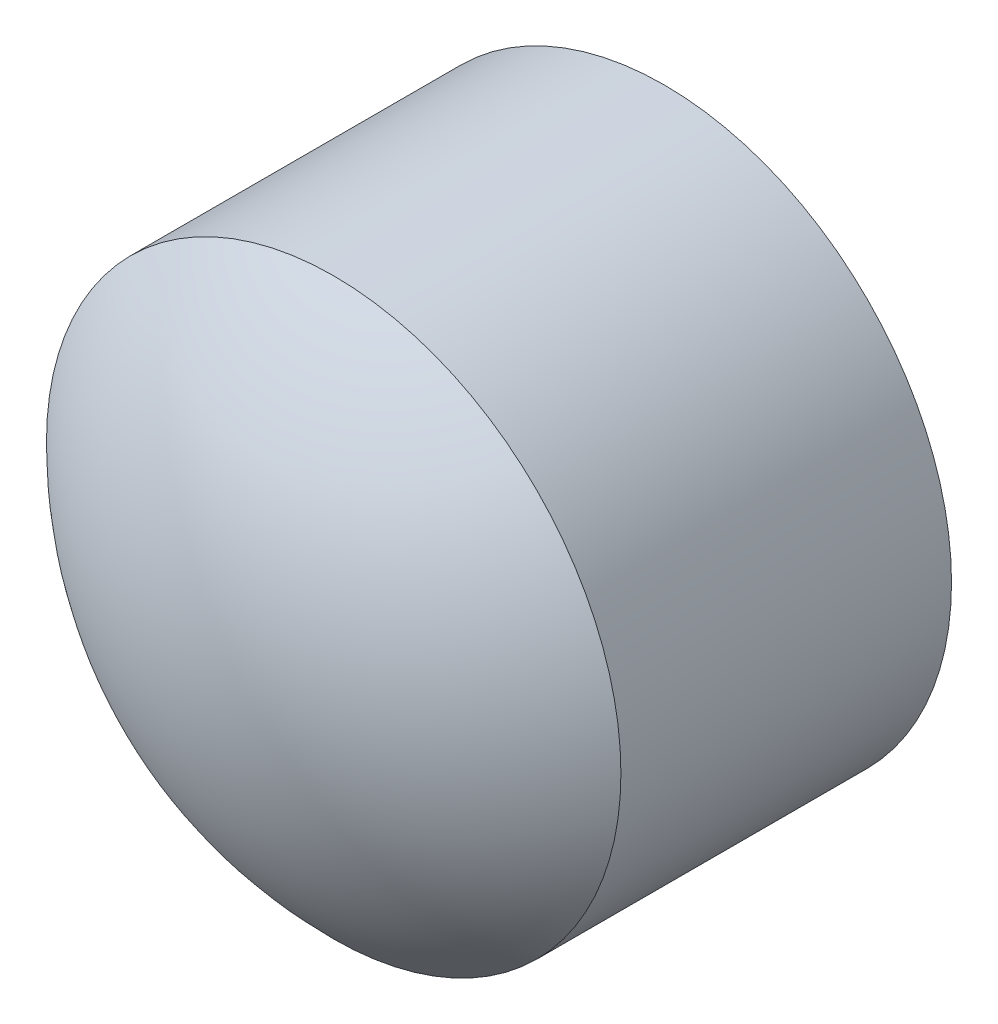
ISO-10303-21;
HEADER;
FILE_DESCRIPTION(('STEP AP214'),'2;1');
FILE_NAME('part.step','',(''),(''),'','','');
FILE_SCHEMA(('AUTOMOTIVE_DESIGN { 1 0 10303 214 1 1 1 1 }'));
ENDSEC;
DATA;
#1=APPLICATION_CONTEXT('core data for automotive mechanical design processes');
#2=APPLICATION_PROTOCOL_DEFINITION('international standard','automotive_design',2000,#1);
#3=PRODUCT_CONTEXT('',#1,'mechanical');
#4=PRODUCT('Part','Part','',(#3));
#5=PRODUCT_RELATED_PRODUCT_CATEGORY('part','',(#4));
#6=PRODUCT_DEFINITION_FORMATION('','',#4);
#7=PRODUCT_DEFINITION_CONTEXT('part definition',#1,'design');
#8=PRODUCT_DEFINITION('design','',#6,#7);
#9=PRODUCT_DEFINITION_SHAPE('','',#8);
#10=(LENGTH_UNIT() NAMED_UNIT(*) SI_UNIT(.MILLI.,.METRE.));
#11=(NAMED_UNIT(*) PLANE_ANGLE_UNIT() SI_UNIT($,.RADIAN.));
#12=(NAMED_UNIT(*) SI_UNIT($,.STERADIAN.) SOLID_ANGLE_UNIT());
#13=UNCERTAINTY_MEASURE_WITH_UNIT(LENGTH_MEASURE(1.E-05),#10,'distance_accuracy_value','');
#14=(GEOMETRIC_REPRESENTATION_CONTEXT(3) GLOBAL_UNCERTAINTY_ASSIGNED_CONTEXT((#13)) GLOBAL_UNIT_ASSIGNED_CONTEXT((#10,
#11,#12)) REPRESENTATION_CONTEXT('',''));
#15=CARTESIAN_POINT('',(0.,0.,0.));
#16=DIRECTION('',(0.,0.,1.));
#17=DIRECTION('',(1.,0.,0.));
#18=AXIS2_PLACEMENT_3D('',#15,#16,#17);
#19=CARTESIAN_POINT('',(0.,0.,16.4006088994022));
#20=DIRECTION('',(0.,0.,1.));
#21=DIRECTION('',(-1.,0.,0.));
#22=AXIS2_PLACEMENT_3D('',#19,#20,#21);
#23=SPHERICAL_SURFACE('',#22,14.5154614102124);
#24=CARTESIAN_POINT('',(0.,0.,2.14522542064513));
#25=DIRECTION('',(0.,0.,1.));
#26=DIRECTION('',(1.,0.,0.));
#27=AXIS2_PLACEMENT_3D('',#24,#25,#26);
#28=CIRCLE('',#27,2.73544545274543);
#29=CARTESIAN_POINT('',(2.73544545274543,0.,2.14522542064513));
#30=VERTEX_POINT('',#29);
#31=EDGE_CURVE('E104',#30,#30,#28,.T.);
#32=ORIENTED_EDGE('',*,*,#31,.F.);
#33=EDGE_LOOP('',(#32));
#34=FACE_BOUND('',#33,.T.);
#35=ADVANCED_FACE('F38',(#34),#23,.T.);
#36=CARTESIAN_POINT('',(0.,0.,10.8994949366117));
#37=DIRECTION('',(0.,0.,1.));
#38=DIRECTION('',(1.,0.,0.));
#39=AXIS2_PLACEMENT_3D('',#36,#37,#38);
#40=CYLINDRICAL_SURFACE('',#39,2.73544545274543);
#41=CARTESIAN_POINT('',(0.,0.,2.6057176451635));
#42=DIRECTION('',(0.,0.,1.));
#43=DIRECTION('',(1.,0.,0.));
#44=AXIS2_PLACEMENT_3D('',#41,#42,#43);
#45=CIRCLE('',#44,2.73544545274543);
#46=CARTESIAN_POINT('',(2.73544545274543,0.,2.6057176451635));
#47=VERTEX_POINT('',#46);
#48=EDGE_CURVE('E101',#47,#47,#45,.T.);
#49=ORIENTED_EDGE('',*,*,#48,.F.);
#50=EDGE_LOOP('',(#49));
#51=FACE_BOUND('',#50,.T.);
#52=ORIENTED_EDGE('',*,*,#31,.T.);
#53=EDGE_LOOP('',(#52));
#54=FACE_BOUND('',#53,.T.);
#55=ADVANCED_FACE('F108',(#51,#54),#40,.T.);
#56=CARTESIAN_POINT('',(-2.73544545274543,0.,2.6057176451635));
#57=DIRECTION('',(0.,0.,1.));
#58=DIRECTION('',(1.,0.,0.));
#59=AXIS2_PLACEMENT_3D('',#56,#57,#58);
#60=PLANE('',#59);
#61=CARTESIAN_POINT('',(0.,0.,2.6057176451635));
#62=DIRECTION('',(0.,0.,1.));
#63=DIRECTION('',(1.,0.,0.));
#64=AXIS2_PLACEMENT_3D('',#61,#62,#63);
#65=CIRCLE('',#64,5.5);
#66=CARTESIAN_POINT('',(5.5,0.,2.6057176451635));
#67=VERTEX_POINT('',#66);
#68=EDGE_CURVE('E46',#67,#67,#65,.F.);
#69=ORIENTED_EDGE('',*,*,#68,.T.);
#70=EDGE_LOOP('',(#69));
#71=FACE_BOUND('',#70,.T.);
#72=ORIENTED_EDGE('',*,*,#48,.T.);
#73=EDGE_LOOP('',(#72));
#74=FACE_BOUND('',#73,.T.);
#75=ADVANCED_FACE('F116',(#71,#74),#60,.F.);
#76=CARTESIAN_POINT('',(0.,0.,1.12027956855392));
#77=DIRECTION('',(0.,0.,-1.));
#78=DIRECTION('',(-1.,0.,0.));
#79=AXIS2_PLACEMENT_3D('',#76,#77,#78);
#80=SPHERICAL_SURFACE('',#79,9.77921536805774);
#81=CARTESIAN_POINT('',(0.,0.,8.));
#82=DIRECTION('',(0.,0.,1.));
#83=DIRECTION('',(1.,0.,0.));
#84=AXIS2_PLACEMENT_3D('',#81,#82,#83);
#85=CIRCLE('',#84,6.95);
#86=CARTESIAN_POINT('',(6.95,0.,8.));
#87=VERTEX_POINT('',#86);
#88=EDGE_CURVE('E54',#87,#87,#85,.T.);
#89=ORIENTED_EDGE('',*,*,#88,.T.);
#90=EDGE_LOOP('',(#89));
#91=FACE_BOUND('',#90,.T.);
#92=ADVANCED_FACE('F122',(#91),#80,.T.);
#93=CARTESIAN_POINT('',(0.,0.,8.));
#94=DIRECTION('',(0.,0.,-1.));
#95=DIRECTION('',(-1.,0.,0.));
#96=AXIS2_PLACEMENT_3D('',#93,#94,#95);
#97=CYLINDRICAL_SURFACE('',#96,6.95);
#98=ORIENTED_EDGE('',*,*,#88,.F.);
#99=EDGE_LOOP('',(#98));
#100=FACE_BOUND('',#99,.T.);
#101=CARTESIAN_POINT('',(0.,0.,0.));
#102=DIRECTION('',(0.,0.,1.));
#103=DIRECTION('',(1.,0.,0.));
#104=AXIS2_PLACEMENT_3D('',#101,#102,#103);
#105=CIRCLE('',#104,6.95);
#106=CARTESIAN_POINT('',(6.95,0.,0.));
#107=VERTEX_POINT('',#106);
#108=EDGE_CURVE('E57',#107,#107,#105,.T.);
#109=ORIENTED_EDGE('',*,*,#108,.T.);
#110=EDGE_LOOP('',(#109));
#111=FACE_BOUND('',#110,.T.);
#112=ADVANCED_FACE('F40',(#100,#111),#97,.T.);
#113=CARTESIAN_POINT('',(0.,0.,0.));
#114=DIRECTION('',(0.,0.,1.));
#115=DIRECTION('',(1.,0.,0.));
#116=AXIS2_PLACEMENT_3D('',#113,#114,#115);
#117=PLANE('',#116);
#118=CARTESIAN_POINT('',(0.,0.,0.));
#119=DIRECTION('',(0.,0.,1.));
#120=DIRECTION('',(1.,0.,0.));
#121=AXIS2_PLACEMENT_3D('',#118,#119,#120);
#122=CIRCLE('',#121,5.5);
#123=CARTESIAN_POINT('',(5.5,0.,0.));
#124=VERTEX_POINT('',#123);
#125=EDGE_CURVE('E65',#124,#124,#122,.T.);
#126=ORIENTED_EDGE('',*,*,#125,.T.);
#127=EDGE_LOOP('',(#126));
#128=FACE_BOUND('',#127,.T.);
#129=ORIENTED_EDGE('',*,*,#108,.F.);
#130=EDGE_LOOP('',(#129));
#131=FACE_BOUND('',#130,.T.);
#132=ADVANCED_FACE('F192',(#128,#131),#117,.F.);
#133=CARTESIAN_POINT('',(0.,0.,0.));
#134=DIRECTION('',(0.,0.,1.));
#135=DIRECTION('',(1.,0.,0.));
#136=AXIS2_PLACEMENT_3D('',#133,#134,#135);
#137=CYLINDRICAL_SURFACE('',#136,5.5);
#138=ORIENTED_EDGE('',*,*,#125,.F.);
#139=EDGE_LOOP('',(#138));
#140=FACE_BOUND('',#139,.T.);
#141=ORIENTED_EDGE('',*,*,#68,.F.);
#142=EDGE_LOOP('',(#141));
#143=FACE_BOUND('',#142,.T.);
#144=ADVANCED_FACE('F185',(#140,#143),#137,.F.);
#145=CLOSED_SHELL('',(#35,#55,#75,#92,#112,#132,#144));
#146=CARTESIAN_POINT('',(0.,0.,3.72106478336912));
#147=DIRECTION('',(0.,0.,1.));
#148=DIRECTION('',(1.,0.,0.));
#149=AXIS2_PLACEMENT_3D('',#146,#147,#148);
#150=CIRCLE('',#149,5.5);
#151=CARTESIAN_POINT('',(5.5,0.,3.72106478336912));
#152=VERTEX_POINT('',#151);
#153=EDGE_CURVE('E50',#152,#152,#150,.F.);
#154=ORIENTED_EDGE('',*,*,#153,.F.);
#155=EDGE_LOOP('',(#154));
#156=FACE_BOUND('',#155,.T.);
#157=CARTESIAN_POINT('',(0.,0.,3.25034469670122));
#158=DIRECTION('',(0.,0.,-1.));
#159=DIRECTION('',(-1.,0.,0.));
#160=AXIS2_PLACEMENT_3D('',#157,#158,#159);
#161=CIRCLE('',#160,5.5);
#162=CARTESIAN_POINT('',(-5.5,0.,3.25034469670122));
#163=VERTEX_POINT('',#162);
#164=EDGE_CURVE('E10',#163,#163,#161,.F.);
#165=ORIENTED_EDGE('',*,*,#164,.F.);
#166=EDGE_LOOP('',(#165));
#167=FACE_BOUND('',#166,.T.);
#168=ADVANCED_FACE('F145',(#156,#167),#137,.F.);
#169=CARTESIAN_POINT('',(0.,0.,2.68657492325472));
#170=DIRECTION('',(0.,0.,1.));
#171=DIRECTION('',(1.,0.,0.));
#172=AXIS2_PLACEMENT_3D('',#169,#170,#171);
#173=SPHERICAL_SURFACE('',#172,3.73646526489964);
#174=CARTESIAN_POINT('',(0.,0.,4.79490913685476));
#175=DIRECTION('',(0.,0.,1.));
#176=DIRECTION('',(1.,0.,0.));
#177=AXIS2_PLACEMENT_3D('',#174,#175,#176);
#178=CIRCLE('',#177,3.08481758286695);
#179=CARTESIAN_POINT('',(3.08481758286695,0.,4.79490913685477));
#180=VERTEX_POINT('',#179);
#181=EDGE_CURVE('E89',#180,#180,#178,.T.);
#182=ORIENTED_EDGE('',*,*,#181,.F.);
#183=EDGE_LOOP('',(#182));
#184=FACE_BOUND('',#183,.T.);
#185=ADVANCED_FACE('F141',(#184),#173,.F.);
#186=CARTESIAN_POINT('',(-3.71397770651986,0.,4.79490913685476));
#187=DIRECTION('',(0.,0.,1.));
#188=DIRECTION('',(1.,0.,0.));
#189=AXIS2_PLACEMENT_3D('',#186,#187,#188);
#190=PLANE('',#189);
#191=CARTESIAN_POINT('',(0.,0.,4.79490913685476));
#192=DIRECTION('',(0.,0.,1.));
#193=DIRECTION('',(1.,0.,0.));
#194=AXIS2_PLACEMENT_3D('',#191,#192,#193);
#195=CIRCLE('',#194,3.71397770651986);
#196=CARTESIAN_POINT('',(3.71397770651986,0.,4.79490913685477));
#197=VERTEX_POINT('',#196);
#198=EDGE_CURVE('E92',#197,#197,#195,.T.);
#199=ORIENTED_EDGE('',*,*,#198,.F.);
#200=EDGE_LOOP('',(#199));
#201=FACE_BOUND('',#200,.T.);
#202=ORIENTED_EDGE('',*,*,#181,.T.);
#203=EDGE_LOOP('',(#202));
#204=FACE_BOUND('',#203,.T.);
#205=ADVANCED_FACE('F137',(#201,#204),#190,.F.);
#206=CARTESIAN_POINT('',(0.,0.,10.8994949366117));
#207=DIRECTION('',(0.,0.,1.));
#208=DIRECTION('',(1.,0.,0.));
#209=AXIS2_PLACEMENT_3D('',#206,#207,#208);
#210=CYLINDRICAL_SURFACE('',#209,3.71397770651986);
#211=CARTESIAN_POINT('',(0.,0.,3.72106478336912));
#212=DIRECTION('',(0.,0.,1.));
#213=DIRECTION('',(1.,0.,0.));
#214=AXIS2_PLACEMENT_3D('',#211,#212,#213);
#215=CIRCLE('',#214,3.71397770651986);
#216=CARTESIAN_POINT('',(3.71397770651986,0.,3.72106478336912));
#217=VERTEX_POINT('',#216);
#218=EDGE_CURVE('E77',#217,#217,#215,.T.);
#219=ORIENTED_EDGE('',*,*,#218,.F.);
#220=EDGE_LOOP('',(#219));
#221=FACE_BOUND('',#220,.T.);
#222=ORIENTED_EDGE('',*,*,#198,.T.);
#223=EDGE_LOOP('',(#222));
#224=FACE_BOUND('',#223,.T.);
#225=ADVANCED_FACE('F140',(#221,#224),#210,.F.);
#226=CARTESIAN_POINT('',(-5.5,0.,3.72106478336912));
#227=DIRECTION('',(0.,0.,1.));
#228=DIRECTION('',(1.,0.,0.));
#229=AXIS2_PLACEMENT_3D('',#226,#227,#228);
#230=PLANE('',#229);
#231=ORIENTED_EDGE('',*,*,#153,.T.);
#232=EDGE_LOOP('',(#231));
#233=FACE_BOUND('',#232,.T.);
#234=ORIENTED_EDGE('',*,*,#218,.T.);
#235=EDGE_LOOP('',(#234));
#236=FACE_BOUND('',#235,.T.);
#237=ADVANCED_FACE('F135',(#233,#236),#230,.F.);
#238=CARTESIAN_POINT('',(0.,0.,10.8873616664678));
#239=DIRECTION('',(0.,0.,1.));
#240=DIRECTION('',(-1.,0.,0.));
#241=AXIS2_PLACEMENT_3D('',#238,#239,#240);
#242=SPHERICAL_SURFACE('',#241,7.16629688309866);
#243=CARTESIAN_POINT('',(0.,0.,4.26368072670597));
#244=DIRECTION('',(0.,0.,1.));
#245=DIRECTION('',(1.,0.,0.));
#246=AXIS2_PLACEMENT_3D('',#243,#244,#245);
#247=CIRCLE('',#246,2.73544545274543);
#248=CARTESIAN_POINT('',(2.73544545274543,0.,4.26368072670597));
#249=VERTEX_POINT('',#248);
#250=EDGE_CURVE('E95',#249,#249,#247,.T.);
#251=ORIENTED_EDGE('',*,*,#250,.T.);
#252=EDGE_LOOP('',(#251));
#253=FACE_BOUND('',#252,.T.);
#254=ADVANCED_FACE('F131',(#253),#242,.F.);
#255=CARTESIAN_POINT('',(0.,0.,10.8994949366117));
#256=DIRECTION('',(0.,0.,1.));
#257=DIRECTION('',(1.,0.,0.));
#258=AXIS2_PLACEMENT_3D('',#255,#256,#257);
#259=CYLINDRICAL_SURFACE('',#258,2.73544545274543);
#260=ORIENTED_EDGE('',*,*,#250,.F.);
#261=EDGE_LOOP('',(#260));
#262=FACE_BOUND('',#261,.T.);
#263=CARTESIAN_POINT('',(0.,0.,3.25034469670122));
#264=DIRECTION('',(0.,0.,1.));
#265=DIRECTION('',(1.,0.,0.));
#266=AXIS2_PLACEMENT_3D('',#263,#264,#265);
#267=CIRCLE('',#266,2.73544545274543);
#268=CARTESIAN_POINT('',(2.73544545274543,0.,3.25034469670122));
#269=VERTEX_POINT('',#268);
#270=EDGE_CURVE('E98',#269,#269,#267,.T.);
#271=ORIENTED_EDGE('',*,*,#270,.T.);
#272=EDGE_LOOP('',(#271));
#273=FACE_BOUND('',#272,.T.);
#274=ADVANCED_FACE('F126',(#262,#273),#259,.T.);
#275=CARTESIAN_POINT('',(-2.73544545274543,0.,3.25034469670122));
#276=DIRECTION('',(0.,0.,-1.));
#277=DIRECTION('',(-1.,0.,0.));
#278=AXIS2_PLACEMENT_3D('',#275,#276,#277);
#279=PLANE('',#278);
#280=ORIENTED_EDGE('',*,*,#270,.F.);
#281=EDGE_LOOP('',(#280));
#282=FACE_BOUND('',#281,.T.);
#283=ORIENTED_EDGE('',*,*,#164,.T.);
#284=EDGE_LOOP('',(#283));
#285=FACE_BOUND('',#284,.T.);
#286=ADVANCED_FACE('F123',(#282,#285),#279,.F.);
#287=CLOSED_SHELL('',(#168,#185,#205,#225,#237,#254,#274,#286));
#288=CARTESIAN_POINT('',(0.,0.,4.));
#289=DIRECTION('',(0.,0.,1.));
#290=DIRECTION('',(1.,0.,0.));
#291=AXIS2_PLACEMENT_3D('',#288,#289,#290);
#292=CYLINDRICAL_SURFACE('',#291,6.5);
#293=CARTESIAN_POINT('',(0.,0.,6.42304018815437));
#294=DIRECTION('',(0.,0.,-1.));
#295=DIRECTION('',(-1.,0.,0.));
#296=AXIS2_PLACEMENT_3D('',#293,#294,#295);
#297=CIRCLE('',#296,6.5);
#298=CARTESIAN_POINT('',(-6.5,0.,6.42304018815437));
#299=VERTEX_POINT('',#298);
#300=EDGE_CURVE('E74',#299,#299,#297,.T.);
#301=ORIENTED_EDGE('',*,*,#300,.F.);
#302=EDGE_LOOP('',(#301));
#303=FACE_BOUND('',#302,.T.);
#304=CARTESIAN_POINT('',(0.,0.,4.));
#305=DIRECTION('',(0.,0.,1.));
#306=DIRECTION('',(1.,0.,0.));
#307=AXIS2_PLACEMENT_3D('',#304,#305,#306);
#308=CIRCLE('',#307,6.5);
#309=CARTESIAN_POINT('',(6.5,0.,4.));
#310=VERTEX_POINT('',#309);
#311=EDGE_CURVE('E60',#310,#310,#308,.T.);
#312=ORIENTED_EDGE('',*,*,#311,.F.);
#313=EDGE_LOOP('',(#312));
#314=FACE_BOUND('',#313,.T.);
#315=ADVANCED_FACE('F188',(#303,#314),#292,.F.);
#316=CARTESIAN_POINT('',(0.,0.,4.));
#317=DIRECTION('',(0.,0.,1.));
#318=DIRECTION('',(1.,0.,0.));
#319=AXIS2_PLACEMENT_3D('',#316,#317,#318);
#320=PLANE('',#319);
#321=CARTESIAN_POINT('',(0.,0.,4.));
#322=DIRECTION('',(0.,0.,1.));
#323=DIRECTION('',(1.,0.,0.));
#324=AXIS2_PLACEMENT_3D('',#321,#322,#323);
#325=CIRCLE('',#324,5.5);
#326=CARTESIAN_POINT('',(5.5,0.,4.));
#327=VERTEX_POINT('',#326);
#328=EDGE_CURVE('E66',#327,#327,#325,.T.);
#329=ORIENTED_EDGE('',*,*,#328,.F.);
#330=EDGE_LOOP('',(#329));
#331=FACE_BOUND('',#330,.T.);
#332=ORIENTED_EDGE('',*,*,#311,.T.);
#333=EDGE_LOOP('',(#332));
#334=FACE_BOUND('',#333,.T.);
#335=ADVANCED_FACE('F174',(#331,#334),#320,.T.);
#336=CARTESIAN_POINT('',(-6.5,0.,6.42304018815437));
#337=DIRECTION('',(0.,0.,-1.));
#338=DIRECTION('',(-1.,0.,0.));
#339=AXIS2_PLACEMENT_3D('',#336,#337,#338);
#340=PLANE('',#339);
#341=ORIENTED_EDGE('',*,*,#300,.T.);
#342=EDGE_LOOP('',(#341));
#343=FACE_BOUND('',#342,.T.);
#344=CARTESIAN_POINT('',(0.,0.,6.42304018815437));
#345=DIRECTION('',(0.,0.,-1.));
#346=DIRECTION('',(-1.,0.,0.));
#347=AXIS2_PLACEMENT_3D('',#344,#345,#346);
#348=CIRCLE('',#347,4.05235762183196);
#349=CARTESIAN_POINT('',(-4.05235762183196,0.,6.42304018815437));
#350=VERTEX_POINT('',#349);
#351=EDGE_CURVE('E69',#350,#350,#348,.T.);
#352=ORIENTED_EDGE('',*,*,#351,.F.);
#353=EDGE_LOOP('',(#352));
#354=FACE_BOUND('',#353,.T.);
#355=ADVANCED_FACE('F171',(#343,#354),#340,.T.);
#356=CARTESIAN_POINT('',(0.,0.,6.0310784745588));
#357=DIRECTION('',(0.,0.,-1.));
#358=DIRECTION('',(-1.,0.,0.));
#359=AXIS2_PLACEMENT_3D('',#356,#357,#358);
#360=SPHERICAL_SURFACE('',#359,4.07126961526062);
#361=ORIENTED_EDGE('',*,*,#351,.T.);
#362=EDGE_LOOP('',(#361));
#363=FACE_BOUND('',#362,.T.);
#364=ADVANCED_FACE('F163',(#363),#360,.F.);
#365=CARTESIAN_POINT('',(0.,0.,10.8994949366117));
#366=DIRECTION('',(0.,0.,1.));
#367=DIRECTION('',(1.,0.,0.));
#368=AXIS2_PLACEMENT_3D('',#365,#366,#367);
#369=CYLINDRICAL_SURFACE('',#368,5.5);
#370=ORIENTED_EDGE('',*,*,#328,.T.);
#371=EDGE_LOOP('',(#370));
#372=FACE_BOUND('',#371,.T.);
#373=CARTESIAN_POINT('',(0.,0.,5.42187218863599));
#374=DIRECTION('',(0.,0.,1.));
#375=DIRECTION('',(1.,0.,0.));
#376=AXIS2_PLACEMENT_3D('',#373,#374,#375);
#377=CIRCLE('',#376,5.5);
#378=CARTESIAN_POINT('',(5.5,0.,5.42187218863599));
#379=VERTEX_POINT('',#378);
#380=EDGE_CURVE('E80',#379,#379,#377,.T.);
#381=ORIENTED_EDGE('',*,*,#380,.F.);
#382=EDGE_LOOP('',(#381));
#383=FACE_BOUND('',#382,.T.);
#384=ADVANCED_FACE('F159',(#372,#383),#369,.T.);
#385=CARTESIAN_POINT('',(-3.71397770651986,0.,5.42187218863598));
#386=DIRECTION('',(0.,0.,-1.));
#387=DIRECTION('',(-1.,0.,0.));
#388=AXIS2_PLACEMENT_3D('',#385,#386,#387);
#389=PLANE('',#388);
#390=CARTESIAN_POINT('',(0.,0.,5.42187218863599));
#391=DIRECTION('',(0.,0.,1.));
#392=DIRECTION('',(1.,0.,0.));
#393=AXIS2_PLACEMENT_3D('',#390,#391,#392);
#394=CIRCLE('',#393,3.71397770651986);
#395=CARTESIAN_POINT('',(3.71397770651986,0.,5.42187218863599));
#396=VERTEX_POINT('',#395);
#397=EDGE_CURVE('E83',#396,#396,#394,.T.);
#398=ORIENTED_EDGE('',*,*,#397,.F.);
#399=EDGE_LOOP('',(#398));
#400=FACE_BOUND('',#399,.T.);
#401=ORIENTED_EDGE('',*,*,#380,.T.);
#402=EDGE_LOOP('',(#401));
#403=FACE_BOUND('',#402,.T.);
#404=ADVANCED_FACE('F155',(#400,#403),#389,.F.);
#405=CARTESIAN_POINT('',(0.,0.,10.8994949366117));
#406=DIRECTION('',(0.,0.,1.));
#407=DIRECTION('',(1.,0.,0.));
#408=AXIS2_PLACEMENT_3D('',#405,#406,#407);
#409=CYLINDRICAL_SURFACE('',#408,3.71397770651986);
#410=CARTESIAN_POINT('',(0.,0.,6.04883524041721));
#411=DIRECTION('',(0.,0.,1.));
#412=DIRECTION('',(1.,0.,0.));
#413=AXIS2_PLACEMENT_3D('',#410,#411,#412);
#414=CIRCLE('',#413,3.71397770651986);
#415=CARTESIAN_POINT('',(3.71397770651986,0.,6.04883524041721));
#416=VERTEX_POINT('',#415);
#417=EDGE_CURVE('E86',#416,#416,#414,.T.);
#418=ORIENTED_EDGE('',*,*,#417,.F.);
#419=EDGE_LOOP('',(#418));
#420=FACE_BOUND('',#419,.T.);
#421=ORIENTED_EDGE('',*,*,#397,.T.);
#422=EDGE_LOOP('',(#421));
#423=FACE_BOUND('',#422,.T.);
#424=ADVANCED_FACE('F149',(#420,#423),#409,.T.);
#425=CARTESIAN_POINT('',(0.,0.,0.358865285046412));
#426=DIRECTION('',(0.,0.,1.));
#427=DIRECTION('',(-1.,0.,0.));
#428=AXIS2_PLACEMENT_3D('',#425,#426,#427);
#429=SPHERICAL_SURFACE('',#428,6.79480599410674);
#430=ORIENTED_EDGE('',*,*,#417,.T.);
#431=EDGE_LOOP('',(#430));
#432=FACE_BOUND('',#431,.T.);
#433=ADVANCED_FACE('F147',(#432),#429,.T.);
#434=CLOSED_SHELL('',(#315,#335,#355,#364,#384,#404,#424,#433));
#435=ORIENTED_CLOSED_SHELL('',*,#287,.T.);
#436=ORIENTED_CLOSED_SHELL('',*,#434,.T.);
#437=BREP_WITH_VOIDS('B2',#145,(#435,#436));
#438=ADVANCED_BREP_SHAPE_REPRESENTATION('',(#18,#437),#14);
#439=SHAPE_DEFINITION_REPRESENTATION(#9,#438);
ENDSEC;
END-ISO-10303-21;
